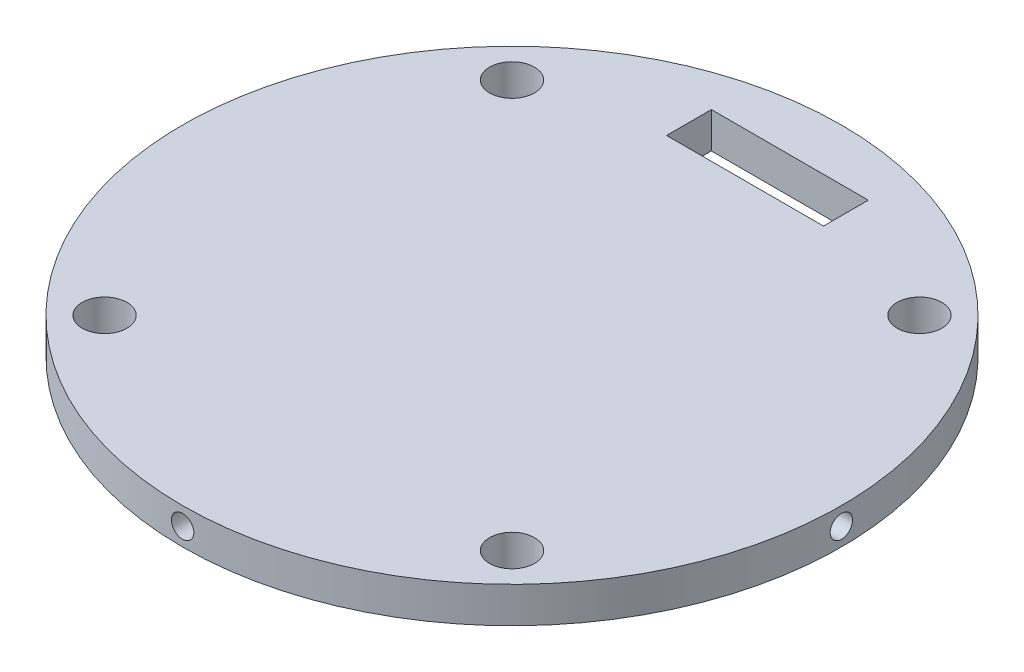
ISO-10303-21;
HEADER;
FILE_DESCRIPTION(('STEP AP214'),'2;1');
FILE_NAME('part.step','',(''),(''),'','','');
FILE_SCHEMA(('AUTOMOTIVE_DESIGN { 1 0 10303 214 1 1 1 1 }'));
ENDSEC;
DATA;
#1=APPLICATION_CONTEXT('core data for automotive mechanical design processes');
#2=APPLICATION_PROTOCOL_DEFINITION('international standard','automotive_design',2000,#1);
#3=PRODUCT_CONTEXT('',#1,'mechanical');
#4=PRODUCT('Part','Part','',(#3));
#5=PRODUCT_RELATED_PRODUCT_CATEGORY('part','',(#4));
#6=PRODUCT_DEFINITION_FORMATION('','',#4);
#7=PRODUCT_DEFINITION_CONTEXT('part definition',#1,'design');
#8=PRODUCT_DEFINITION('design','',#6,#7);
#9=PRODUCT_DEFINITION_SHAPE('','',#8);
#10=(LENGTH_UNIT() NAMED_UNIT(*) SI_UNIT(.MILLI.,.METRE.));
#11=(NAMED_UNIT(*) PLANE_ANGLE_UNIT() SI_UNIT($,.RADIAN.));
#12=(NAMED_UNIT(*) SI_UNIT($,.STERADIAN.) SOLID_ANGLE_UNIT());
#13=UNCERTAINTY_MEASURE_WITH_UNIT(LENGTH_MEASURE(1.E-05),#10,'distance_accuracy_value','');
#14=(GEOMETRIC_REPRESENTATION_CONTEXT(3) GLOBAL_UNCERTAINTY_ASSIGNED_CONTEXT((#13)) GLOBAL_UNIT_ASSIGNED_CONTEXT((#10,
#11,#12)) REPRESENTATION_CONTEXT('',''));
#15=CARTESIAN_POINT('',(0.,0.,0.));
#16=DIRECTION('',(0.,0.,1.));
#17=DIRECTION('',(1.,0.,0.));
#18=AXIS2_PLACEMENT_3D('',#15,#16,#17);
#19=CARTESIAN_POINT('',(0.,8.,0.));
#20=DIRECTION('',(0.,-1.,0.));
#21=DIRECTION('',(0.,0.,-1.));
#22=AXIS2_PLACEMENT_3D('',#19,#20,#21);
#23=CYLINDRICAL_SURFACE('',#22,73.5);
#24=CARTESIAN_POINT('',(73.4574706888278,4.,-2.5));
#25=CARTESIAN_POINT('',(73.4574712622716,3.85961748750618,-2.49999378797786));
#26=CARTESIAN_POINT('',(73.457877433653,3.71913421822508,-2.48813595638693));
#27=CARTESIAN_POINT('',(73.4594586071754,3.44203965206217,-2.44099893755281));
#28=CARTESIAN_POINT('',(73.4606345256605,3.30543317278096,-2.40569183443414));
#29=CARTESIAN_POINT('',(73.4636218332567,3.04014649894273,-2.312665230355));
#30=CARTESIAN_POINT('',(73.4654329093494,2.91146243671405,-2.25495676774213));
#31=CARTESIAN_POINT('',(73.4694860608808,2.66564409180731,-2.11878159039217));
#32=CARTESIAN_POINT('',(73.4717280316305,2.54850701414146,-2.04031991606191));
#33=CARTESIAN_POINT('',(73.4763917678385,2.32900797833675,-1.8648161098748));
#34=CARTESIAN_POINT('',(73.4788136166097,2.22665293213073,-1.767765334959));
#35=CARTESIAN_POINT('',(73.4835633926053,2.03968182025653,-1.55785397861684));
#36=CARTESIAN_POINT('',(73.4858913160716,1.95506646381763,-1.44499276539309));
#37=CARTESIAN_POINT('',(73.4901913220274,1.80596341937627,-1.20663547961479));
#38=CARTESIAN_POINT('',(73.4921633247484,1.74148024101822,-1.081136584511));
#39=CARTESIAN_POINT('',(73.495528498753,1.63450120402087,-0.821086431693563));
#40=CARTESIAN_POINT('',(73.4969216726875,1.59200524468784,-0.686535215439559));
#41=CARTESIAN_POINT('',(73.4989716685034,1.53022280831058,-0.412255408866176));
#42=CARTESIAN_POINT('',(73.49962877744,1.51092728320195,-0.272528858832926));
#43=CARTESIAN_POINT('',(73.5001335370028,1.49606555651991,0.00818155430278185));
#44=CARTESIAN_POINT('',(73.4999811913629,1.50049924548595,0.149165411602408));
#45=CARTESIAN_POINT('',(73.4988844585131,1.53296248777348,0.4283271409808));
#46=CARTESIAN_POINT('',(73.4979403988993,1.56098228163711,0.56650614943497));
#47=CARTESIAN_POINT('',(73.4953670036,1.63980724962831,0.836197980732511));
#48=CARTESIAN_POINT('',(73.4937376661873,1.69061248118368,0.967710786773639));
#49=CARTESIAN_POINT('',(73.4899767691777,1.81357733496299,1.22036846033966));
#50=CARTESIAN_POINT('',(73.4878451045113,1.885741425528,1.34151115156005));
#51=CARTESIAN_POINT('',(73.4833197582754,2.04937221514115,1.56996594533198));
#52=CARTESIAN_POINT('',(73.480926075906,2.14083897311817,1.67727800565857));
#53=CARTESIAN_POINT('',(73.4761449915797,2.34053392070794,1.87508223686694));
#54=CARTESIAN_POINT('',(73.4737575934187,2.44877057778614,1.96556585965951));
#55=CARTESIAN_POINT('',(73.4692594536802,2.67890303336849,2.12707889843305));
#56=CARTESIAN_POINT('',(73.4671487121518,2.80079883429518,2.19810831096368));
#57=CARTESIAN_POINT('',(73.4634419794378,3.05479425959919,2.31869576061696));
#58=CARTESIAN_POINT('',(73.4618459950669,3.1868940190337,2.36825351348837));
#59=CARTESIAN_POINT('',(73.4593490202683,3.4575453199057,2.44448534231775));
#60=CARTESIAN_POINT('',(73.4584480274123,3.59609683879799,2.47115949823439));
#61=CARTESIAN_POINT('',(73.4574430716175,3.8756442930076,2.50085644835012));
#62=CARTESIAN_POINT('',(73.4573387094769,4.01663896851986,2.5038910886235));
#63=CARTESIAN_POINT('',(73.4579377412626,4.29713573805479,2.48625374229215));
#64=CARTESIAN_POINT('',(73.4586411339745,4.43663783432062,2.46558179132065));
#65=CARTESIAN_POINT('',(73.46077602046,4.71015639074837,2.40112787809352));
#66=CARTESIAN_POINT('',(73.4622073444258,4.84417412239683,2.35735130546027));
#67=CARTESIAN_POINT('',(73.4656366007052,5.10295872858928,2.24793627086017));
#68=CARTESIAN_POINT('',(73.4676345345038,5.22772557888512,2.18229775159188));
#69=CARTESIAN_POINT('',(73.4719727646031,5.46452129599931,2.03099155343022));
#70=CARTESIAN_POINT('',(73.4743131970852,5.57654506437844,1.9453158993884));
#71=CARTESIAN_POINT('',(73.4790721118863,5.78462344538334,1.75637915139395));
#72=CARTESIAN_POINT('',(73.4814905944523,5.88067800742724,1.653118001742));
#73=CARTESIAN_POINT('',(73.4861341438352,6.0541309122446,1.43189071281271));
#74=CARTESIAN_POINT('',(73.4883591311991,6.13152161419251,1.31391858086674));
#75=CARTESIAN_POINT('',(73.4923637533814,6.26539772405102,1.06664864838359));
#76=CARTESIAN_POINT('',(73.494143389354,6.321883186151,0.937350877205171));
#77=CARTESIAN_POINT('',(73.4970563249387,6.41233200126797,0.671128703077347));
#78=CARTESIAN_POINT('',(73.4981897663099,6.4463002942651,0.534205980095394));
#79=CARTESIAN_POINT('',(73.4996831122391,6.49076673153445,0.256596892157334));
#80=CARTESIAN_POINT('',(73.500043018066,6.50126491430777,0.115910533375593));
#81=CARTESIAN_POINT('',(73.4999487332529,6.49849256865381,-0.165156005574351));
#82=CARTESIAN_POINT('',(73.4994949544985,6.48523406581328,-0.305536304657171));
#83=CARTESIAN_POINT('',(73.4978252330947,6.43534947000083,-0.582077162498));
#84=CARTESIAN_POINT('',(73.4966092889458,6.3987233310542,-0.718237712953299));
#85=CARTESIAN_POINT('',(73.4935521718467,6.30314504964116,-0.982477939537691));
#86=CARTESIAN_POINT('',(73.4917109890754,6.24419255647912,-1.11055748869598));
#87=CARTESIAN_POINT('',(73.487610787238,6.10563845355725,-1.35499928091319));
#88=CARTESIAN_POINT('',(73.4853517829152,6.02603757236324,-1.47136193719448));
#89=CARTESIAN_POINT('',(73.4806692227038,5.84840822124435,-1.68912375275256));
#90=CARTESIAN_POINT('',(73.4782456014582,5.75037240454409,-1.79051691746097));
#91=CARTESIAN_POINT('',(73.4735070684784,5.5386415436037,-1.97543412424416));
#92=CARTESIAN_POINT('',(73.4711921837825,5.42494263194273,-2.05895374006296));
#93=CARTESIAN_POINT('',(73.466931260077,5.18506142873199,-2.20577120126111));
#94=CARTESIAN_POINT('',(73.4649854795885,5.05887048119708,-2.26905489448613));
#95=CARTESIAN_POINT('',(73.4616867821721,4.79774522867527,-2.37346362297181));
#96=CARTESIAN_POINT('',(73.4603331597039,4.66282154984901,-2.4146150417272));
#97=CARTESIAN_POINT('',(73.4587327079301,4.43920649300823,-2.46270341977712));
#98=CARTESIAN_POINT('',(73.4582615118189,4.35196609015409,-2.47667199765444));
#99=CARTESIAN_POINT('',(73.4576303220448,4.17649706944645,-2.4953222389618));
#100=CARTESIAN_POINT('',(73.457470328263,4.08826845197044,-2.50000390593934));
#101=CARTESIAN_POINT('',(73.4574706888278,4.,-2.5));
#102=B_SPLINE_CURVE_WITH_KNOTS('',3,(#24,#25,#26,#27,#28,#29,#30,#31,#32,#33,#34,#35,#36,#37,
#38,#39,#40,#41,#42,#43,#44,#45,#46,#47,#48,#49,#50,#51,#52,#53,#54,#55,#56,#57,#58,#59,#60,#61,
#62,#63,#64,#65,#66,#67,#68,#69,#70,#71,#72,#73,#74,#75,#76,#77,#78,#79,#80,#81,#82,#83,#84,#85,
#86,#87,#88,#89,#90,#91,#92,#93,#94,#95,#96,#97,#98,#99,#100,#101),.UNSPECIFIED.,.T.,.F.,(4,2,2,
2,2,2,2,2,2,2,2,2,2,2,2,2,2,2,2,2,2,2,2,2,2,2,2,2,2,2,2,2,2,2,2,2,2,2,4),(0.,0.420825342517007,
0.842152569109672,1.26327244825028,1.68429014226457,2.10550406701698,2.52673482860853,
2.94805987906826,3.36938299999009,3.79054175344879,4.21169856414464,4.63268119420029,
5.05366488529501,5.47473670983931,5.895809819887,6.31709623543066,6.73838272569223,
7.15967479295841,7.58096538816182,8.00204485548073,8.42312368987853,8.844104342469,
9.26508609848301,9.68623569900684,10.1073866334811,10.528709691987,10.9500316583554,
11.3712611614319,11.7924899735099,12.2135056206399,12.6345220961009,13.055545185036,
13.4765534204478,13.8977297949575,14.3190103503826,14.7405848906068,15.1616557590356,
15.4262586291741,15.6908613982372),.UNSPECIFIED.);
#103=CARTESIAN_POINT('',(73.4574706888278,4.,-2.5));
#104=VERTEX_POINT('',#103);
#105=EDGE_CURVE('E76',#104,#104,#102,.T.);
#106=ORIENTED_EDGE('',*,*,#105,.T.);
#107=EDGE_LOOP('',(#106));
#108=FACE_BOUND('',#107,.T.);
#109=CARTESIAN_POINT('',(2.5,4.,73.4574706888278));
#110=CARTESIAN_POINT('',(2.49999378797786,3.85961748750618,73.4574712622716));
#111=CARTESIAN_POINT('',(2.48813595638693,3.71913421822508,73.457877433653));
#112=CARTESIAN_POINT('',(2.44099893755281,3.44203965206217,73.4594586071754));
#113=CARTESIAN_POINT('',(2.40569183443414,3.30543317278096,73.4606345256605));
#114=CARTESIAN_POINT('',(2.312665230355,3.04014649894273,73.4636218332567));
#115=CARTESIAN_POINT('',(2.25495676774213,2.91146243671405,73.4654329093494));
#116=CARTESIAN_POINT('',(2.11878159039218,2.66564409180731,73.4694860608808));
#117=CARTESIAN_POINT('',(2.04031991606191,2.54850701414146,73.4717280316305));
#118=CARTESIAN_POINT('',(1.8648161098748,2.32900797833675,73.4763917678385));
#119=CARTESIAN_POINT('',(1.767765334959,2.22665293213073,73.4788136166097));
#120=CARTESIAN_POINT('',(1.55785397861684,2.03968182025654,73.4835633926053));
#121=CARTESIAN_POINT('',(1.44499276539309,1.95506646381763,73.4858913160716));
#122=CARTESIAN_POINT('',(1.20663547961479,1.80596341937627,73.4901913220274));
#123=CARTESIAN_POINT('',(1.081136584511,1.74148024101822,73.4921633247484));
#124=CARTESIAN_POINT('',(0.821086431693563,1.63450120402087,73.495528498753));
#125=CARTESIAN_POINT('',(0.686535215439558,1.59200524468784,73.4969216726875));
#126=CARTESIAN_POINT('',(0.412255408866175,1.53022280831058,73.4989716685034));
#127=CARTESIAN_POINT('',(0.272528858832926,1.51092728320195,73.49962877744));
#128=CARTESIAN_POINT('',(-0.00818155430278177,1.49606555651991,73.5001335370028));
#129=CARTESIAN_POINT('',(-0.149165411602408,1.50049924548595,73.4999811913629));
#130=CARTESIAN_POINT('',(-0.428327140980801,1.53296248777348,73.4988844585131));
#131=CARTESIAN_POINT('',(-0.566506149434971,1.56098228163711,73.4979403988993));
#132=CARTESIAN_POINT('',(-0.836197980732512,1.63980724962831,73.4953670036));
#133=CARTESIAN_POINT('',(-0.967710786773639,1.69061248118368,73.4937376661873));
#134=CARTESIAN_POINT('',(-1.22036846033966,1.81357733496299,73.4899767691777));
#135=CARTESIAN_POINT('',(-1.34151115156005,1.88574142552799,73.4878451045113));
#136=CARTESIAN_POINT('',(-1.56996594533198,2.04937221514115,73.4833197582754));
#137=CARTESIAN_POINT('',(-1.67727800565857,2.14083897311817,73.480926075906));
#138=CARTESIAN_POINT('',(-1.87508223686694,2.34053392070794,73.4761449915797));
#139=CARTESIAN_POINT('',(-1.96556585965951,2.44877057778614,73.4737575934187));
#140=CARTESIAN_POINT('',(-2.12707889843305,2.67890303336849,73.4692594536802));
#141=CARTESIAN_POINT('',(-2.19810831096368,2.80079883429518,73.4671487121518));
#142=CARTESIAN_POINT('',(-2.31869576061696,3.05479425959919,73.4634419794378));
#143=CARTESIAN_POINT('',(-2.36825351348837,3.1868940190337,73.4618459950669));
#144=CARTESIAN_POINT('',(-2.44448534231775,3.4575453199057,73.4593490202683));
#145=CARTESIAN_POINT('',(-2.47115949823439,3.59609683879799,73.4584480274123));
#146=CARTESIAN_POINT('',(-2.50085644835012,3.8756442930076,73.4574430716175));
#147=CARTESIAN_POINT('',(-2.5038910886235,4.01663896851986,73.4573387094769));
#148=CARTESIAN_POINT('',(-2.48625374229215,4.29713573805479,73.4579377412626));
#149=CARTESIAN_POINT('',(-2.46558179132065,4.43663783432062,73.4586411339745));
#150=CARTESIAN_POINT('',(-2.40112787809352,4.71015639074837,73.46077602046));
#151=CARTESIAN_POINT('',(-2.35735130546027,4.84417412239683,73.4622073444258));
#152=CARTESIAN_POINT('',(-2.24793627086017,5.10295872858928,73.4656366007052));
#153=CARTESIAN_POINT('',(-2.18229775159188,5.22772557888512,73.4676345345038));
#154=CARTESIAN_POINT('',(-2.03099155343022,5.46452129599931,73.4719727646031));
#155=CARTESIAN_POINT('',(-1.9453158993884,5.57654506437844,73.4743131970852));
#156=CARTESIAN_POINT('',(-1.75637915139395,5.78462344538334,73.4790721118863));
#157=CARTESIAN_POINT('',(-1.653118001742,5.88067800742724,73.4814905944523));
#158=CARTESIAN_POINT('',(-1.43189071281271,6.0541309122446,73.4861341438352));
#159=CARTESIAN_POINT('',(-1.31391858086674,6.13152161419251,73.4883591311991));
#160=CARTESIAN_POINT('',(-1.06664864838359,6.26539772405102,73.4923637533814));
#161=CARTESIAN_POINT('',(-0.937350877205169,6.321883186151,73.494143389354));
#162=CARTESIAN_POINT('',(-0.671128703077346,6.41233200126797,73.4970563249387));
#163=CARTESIAN_POINT('',(-0.534205980095393,6.4463002942651,73.4981897663099));
#164=CARTESIAN_POINT('',(-0.256596892157332,6.49076673153445,73.4996831122391));
#165=CARTESIAN_POINT('',(-0.115910533375592,6.50126491430777,73.500043018066));
#166=CARTESIAN_POINT('',(0.165156005574352,6.49849256865381,73.4999487332529));
#167=CARTESIAN_POINT('',(0.305536304657172,6.48523406581328,73.4994949544985));
#168=CARTESIAN_POINT('',(0.582077162498,6.43534947000083,73.4978252330947));
#169=CARTESIAN_POINT('',(0.718237712953299,6.3987233310542,73.4966092889458));
#170=CARTESIAN_POINT('',(0.982477939537691,6.30314504964116,73.4935521718467));
#171=CARTESIAN_POINT('',(1.11055748869598,6.24419255647912,73.4917109890754));
#172=CARTESIAN_POINT('',(1.35499928091319,6.10563845355725,73.487610787238));
#173=CARTESIAN_POINT('',(1.47136193719448,6.02603757236324,73.4853517829152));
#174=CARTESIAN_POINT('',(1.68912375275256,5.84840822124435,73.4806692227038));
#175=CARTESIAN_POINT('',(1.79051691746097,5.75037240454409,73.4782456014582));
#176=CARTESIAN_POINT('',(1.97543412424416,5.5386415436037,73.4735070684784));
#177=CARTESIAN_POINT('',(2.05895374006296,5.42494263194272,73.4711921837825));
#178=CARTESIAN_POINT('',(2.20577120126111,5.18506142873199,73.466931260077));
#179=CARTESIAN_POINT('',(2.26905489448613,5.05887048119708,73.4649854795885));
#180=CARTESIAN_POINT('',(2.37346362297181,4.79774522867527,73.4616867821721));
#181=CARTESIAN_POINT('',(2.4146150417272,4.66282154984901,73.4603331597039));
#182=CARTESIAN_POINT('',(2.46270341977712,4.43920649300823,73.4587327079301));
#183=CARTESIAN_POINT('',(2.47667199765444,4.35196609015409,73.4582615118189));
#184=CARTESIAN_POINT('',(2.4953222389618,4.17649706944645,73.4576303220448));
#185=CARTESIAN_POINT('',(2.50000390593934,4.08826845197044,73.457470328263));
#186=CARTESIAN_POINT('',(2.5,4.,73.4574706888278));
#187=B_SPLINE_CURVE_WITH_KNOTS('',3,(#109,#110,#111,#112,#113,#114,#115,#116,#117,#118,#119,
#120,#121,#122,#123,#124,#125,#126,#127,#128,#129,#130,#131,#132,#133,#134,#135,#136,#137,#138,
#139,#140,#141,#142,#143,#144,#145,#146,#147,#148,#149,#150,#151,#152,#153,#154,#155,#156,#157,
#158,#159,#160,#161,#162,#163,#164,#165,#166,#167,#168,#169,#170,#171,#172,#173,#174,#175,#176,
#177,#178,#179,#180,#181,#182,#183,#184,#185,#186),.UNSPECIFIED.,.T.,.F.,(4,2,2,2,2,2,2,2,2,2,2,
2,2,2,2,2,2,2,2,2,2,2,2,2,2,2,2,2,2,2,2,2,2,2,2,2,2,2,4),(0.,0.420825342517007,
0.842152569109672,1.26327244825028,1.68429014226457,2.10550406701698,2.52673482860853,
2.94805987906826,3.36938299999009,3.79054175344879,4.21169856414464,4.63268119420029,
5.05366488529501,5.47473670983931,5.895809819887,6.31709623543066,6.73838272569223,
7.15967479295841,7.58096538816182,8.00204485548073,8.42312368987853,8.844104342469,
9.26508609848301,9.68623569900685,10.1073866334811,10.528709691987,10.9500316583554,
11.3712611614319,11.7924899735099,12.2135056206399,12.6345220961009,13.055545185036,
13.4765534204478,13.8977297949575,14.3190103503826,14.7405848906068,15.1616557590356,
15.4262586291741,15.6908613982372),.UNSPECIFIED.);
#188=CARTESIAN_POINT('',(2.5,4.,73.4574706888278));
#189=VERTEX_POINT('',#188);
#190=EDGE_CURVE('E165',#189,#189,#187,.T.);
#191=ORIENTED_EDGE('',*,*,#190,.T.);
#192=EDGE_LOOP('',(#191));
#193=FACE_BOUND('',#192,.T.);
#194=CARTESIAN_POINT('',(0.,8.,0.));
#195=DIRECTION('',(0.,1.,0.));
#196=DIRECTION('',(0.,0.,1.));
#197=AXIS2_PLACEMENT_3D('',#194,#195,#196);
#198=CIRCLE('',#197,73.5);
#199=CARTESIAN_POINT('',(0.,8.,73.5));
#200=VERTEX_POINT('',#199);
#201=EDGE_CURVE('E161',#200,#200,#198,.T.);
#202=ORIENTED_EDGE('',*,*,#201,.F.);
#203=EDGE_LOOP('',(#202));
#204=FACE_BOUND('',#203,.T.);
#205=CARTESIAN_POINT('',(0.,0.,0.));
#206=DIRECTION('',(0.,1.,0.));
#207=DIRECTION('',(0.,0.,1.));
#208=AXIS2_PLACEMENT_3D('',#205,#206,#207);
#209=CIRCLE('',#208,73.5);
#210=CARTESIAN_POINT('',(0.,0.,73.5));
#211=VERTEX_POINT('',#210);
#212=EDGE_CURVE('E127',#211,#211,#209,.T.);
#213=ORIENTED_EDGE('',*,*,#212,.T.);
#214=EDGE_LOOP('',(#213));
#215=FACE_BOUND('',#214,.T.);
#216=CARTESIAN_POINT('',(0.,6.5,-73.5));
#217=CARTESIAN_POINT('',(0.140382538984424,6.49999378800196,-73.4999994278152));
#218=CARTESIAN_POINT('',(0.280865834664872,6.48813595208722,-73.4995934976701));
#219=CARTESIAN_POINT('',(0.557960455680913,6.44099891451636,-73.4980131855351));
#220=CARTESIAN_POINT('',(0.694566963436558,6.40569179707416,-73.4968378876561));
#221=CARTESIAN_POINT('',(0.959853697461806,6.31266515108598,-73.493851927307));
#222=CARTESIAN_POINT('',(1.08853779116185,6.2549566602038,-73.4920415777834));
#223=CARTESIAN_POINT('',(1.33435618870694,6.11878141630065,-73.4879896671177));
#224=CARTESIAN_POINT('',(1.45149328757978,6.0403197037568,-73.4857482107175));
#225=CARTESIAN_POINT('',(1.67099229905839,5.86481585912662,-73.4810850673533));
#226=CARTESIAN_POINT('',(1.77334730653927,5.76776509250281,-73.4786632969551));
#227=CARTESIAN_POINT('',(1.96031834378135,5.55785376895374,-73.4739132059357));
#228=CARTESIAN_POINT('',(2.0449336641947,5.44499258012605,-73.4715848890544));
#229=CARTESIAN_POINT('',(2.19403667125942,5.20663531534524,-73.4672837962089));
#230=CARTESIAN_POINT('',(2.25851984156745,5.08113641265133,-73.4653111000646));
#231=CARTESIAN_POINT('',(2.36549886158231,4.82108624332836,-73.4619445438615));
#232=CARTESIAN_POINT('',(2.40799481208088,4.68653501819929,-73.4605506811492));
#233=CARTESIAN_POINT('',(2.46977722955959,4.41225518598351,-73.4584996149302));
#234=CARTESIAN_POINT('',(2.48907274398144,4.27252861904397,-73.4578421242683));
#235=CARTESIAN_POINT('',(2.50393444343375,3.99181817291948,-73.4573370753577));
#236=CARTESIAN_POINT('',(2.49950073803711,3.85083429954331,-73.4574895133689));
#237=CARTESIAN_POINT('',(2.46703747005589,3.57167264348462,-73.4585868643791));
#238=CARTESIAN_POINT('',(2.43901768346014,3.43349372249889,-73.4595314490475));
#239=CARTESIAN_POINT('',(2.36019276044906,3.16380206239607,-73.4621060967638));
#240=CARTESIAN_POINT('',(2.30938756644436,3.03228934012853,-73.4637361615444));
#241=CARTESIAN_POINT('',(2.18642278975219,2.77963176686817,-73.4674983981412));
#242=CARTESIAN_POINT('',(2.11425872985278,2.65848909650015,-73.4696306752114));
#243=CARTESIAN_POINT('',(1.95062800533507,2.4300343313642,-73.4741568622327));
#244=CARTESIAN_POINT('',(1.85916128180767,2.32272227880703,-73.4765507729824));
#245=CARTESIAN_POINT('',(1.65946635826392,2.12491800749424,-73.4813318312139));
#246=CARTESIAN_POINT('',(1.55122968384991,2.03443434381682,-73.4837189746514));
#247=CARTESIAN_POINT('',(1.32109717915791,1.87292123087041,-73.4882162320466));
#248=CARTESIAN_POINT('',(1.19920134651465,1.80189178497017,-73.4903263459563));
#249=CARTESIAN_POINT('',(0.945205913456655,1.68130431145119,-73.4940317249041));
#250=CARTESIAN_POINT('',(0.813106182949321,1.63174655763485,-73.4956269833769));
#251=CARTESIAN_POINT('',(0.542454944826804,1.55551471801459,-73.4981227273887));
#252=CARTESIAN_POINT('',(0.403903459708727,1.52884055242248,-73.4990232153503));
#253=CARTESIAN_POINT('',(0.124356019868988,1.49914356595111,-73.5000276044833));
#254=CARTESIAN_POINT('',(-0.0166386760283466,1.49610890821867,-73.5001319043241));
#255=CARTESIAN_POINT('',(-0.297135490556803,1.51374622691178,-73.4995332169696));
#256=CARTESIAN_POINT('',(-0.43663761143122,1.53441816770197,-73.4988302309878));
#257=CARTESIAN_POINT('',(-0.710156283495734,1.59887208508942,-73.4966964484268));
#258=CARTESIAN_POINT('',(-0.844174103749516,1.64264868232644,-73.4952658212642));
#259=CARTESIAN_POINT('',(-1.10295887622977,1.75206379589191,-73.4918379435318));
#260=CARTESIAN_POINT('',(-1.22772580426884,1.81770236937827,-73.4898406914806));
#261=CARTESIAN_POINT('',(-1.4645215722817,1.96900864616024,-73.4855035131953));
#262=CARTESIAN_POINT('',(-1.57654532263404,2.05468431080589,-73.4831634508906));
#263=CARTESIAN_POINT('',(-1.78462366231034,2.2436210698814,-73.4784048010443));
#264=CARTESIAN_POINT('',(-1.88067820097591,2.34688222009477,-73.4759862132537));
#265=CARTESIAN_POINT('',(-2.05413105822083,2.5681094984014,-73.4713420241594));
#266=CARTESIAN_POINT('',(-2.13152173599086,2.68608161914558,-73.4691165021331));
#267=CARTESIAN_POINT('',(-2.26539780336311,2.93335152305609,-73.465110615266));
#268=CARTESIAN_POINT('',(-2.32188324715466,3.06264927686371,-73.4633302492713));
#269=CARTESIAN_POINT('',(-2.41233204949503,3.32887146435197,-73.4604159782144));
#270=CARTESIAN_POINT('',(-2.4463003401112,3.46579422075523,-73.4592819315927));
#271=CARTESIAN_POINT('',(-2.4907667612835,3.74340337894073,-73.457787765796));
#272=CARTESIAN_POINT('',(-2.50126493051736,3.88408977452029,-73.4574276453457));
#273=CARTESIAN_POINT('',(-2.4984925466326,4.16515628784824,-73.4575219859641));
#274=CARTESIAN_POINT('',(-2.48523403517698,4.30553652467224,-73.4579760343512));
#275=CARTESIAN_POINT('',(-2.43534944409671,4.58207725592089,-73.4596466603056));
#276=CARTESIAN_POINT('',(-2.39872331838532,4.71823774202257,-73.4608632393767));
#277=CARTESIAN_POINT('',(-2.30314508631466,4.98247784410426,-73.4639217136883));
#278=CARTESIAN_POINT('',(-2.24419262919472,5.11055733308986,-73.4657636187531));
#279=CARTESIAN_POINT('',(-2.10563861687906,5.35499902009289,-73.4698650359931));
#280=CARTESIAN_POINT('',(-2.02603779018446,5.47136163129586,-73.4721245334344));
#281=CARTESIAN_POINT('',(-1.84840849760427,5.68912345283528,-73.4768076367129));
#282=CARTESIAN_POINT('',(-1.75037267258214,5.79051665852353,-73.4792313078392));
#283=CARTESIAN_POINT('',(-1.53864177833553,5.97543394408469,-73.4839694736155));
#284=CARTESIAN_POINT('',(-1.42494284177839,6.0589535978068,-73.4862839411123));
#285=CARTESIAN_POINT('',(-1.18506161972667,6.2057710982079,-73.4905437451081));
#286=CARTESIAN_POINT('',(-1.05887068266936,6.26905479996925,-73.4924888230202));
#287=CARTESIAN_POINT('',(-0.797745452640491,6.37346354734945,-73.4957861403198));
#288=CARTESIAN_POINT('',(-0.662821785772331,6.41461497632609,-73.4971390852151));
#289=CARTESIAN_POINT('',(-0.439206701433079,6.46270338419028,-73.4987386933374));
#290=CARTESIAN_POINT('',(-0.351966257017748,6.47667197545255,-73.4992096268259));
#291=CARTESIAN_POINT('',(-0.176497152977433,6.49532223454973,-73.4998404599846));
#292=CARTESIAN_POINT('',(-0.0882684937292193,6.5000039059253,-73.5000003597733));
#293=CARTESIAN_POINT('',(0.,6.5,-73.5));
#294=B_SPLINE_CURVE_WITH_KNOTS('',3,(#216,#217,#218,#219,#220,#221,#222,#223,#224,#225,#226,
#227,#228,#229,#230,#231,#232,#233,#234,#235,#236,#237,#238,#239,#240,#241,#242,#243,#244,#245,
#246,#247,#248,#249,#250,#251,#252,#253,#254,#255,#256,#257,#258,#259,#260,#261,#262,#263,#264,
#265,#266,#267,#268,#269,#270,#271,#272,#273,#274,#275,#276,#277,#278,#279,#280,#281,#282,#283,
#284,#285,#286,#287,#288,#289,#290,#291,#292,#293),.UNSPECIFIED.,.T.,.F.,(4,2,2,2,2,2,2,2,2,2,2,
2,2,2,2,2,2,2,2,2,2,2,2,2,2,2,2,2,2,2,2,2,2,2,2,2,2,2,4),(0.,0.420825422071724,
0.842152726489436,1.26327269637426,1.68429047973583,2.10550430042737,2.52673496077095,
2.94806005005381,3.36938320792081,3.79054200963936,4.21169886660157,4.63268124784051,
5.05366469310461,5.47473644683094,5.89580948562934,6.31709600442943,6.73838259618098,
7.15967455993046,7.5809650547555,8.00204458603132,8.42312348434848,8.84410438785236,
9.26508639201494,9.68623595025574,10.1073868444642,10.5287098623156,10.9500317880304,
11.3712613985522,11.7924903149057,12.2135057813275,12.634522078099,13.0555449895751,
13.4765530488395,13.8977295300577,14.3190101897277,14.7405846838421,15.1616555087977,
15.4262585040121,15.6908613983461),.UNSPECIFIED.);
#295=CARTESIAN_POINT('',(0.,6.5,-73.5));
#296=VERTEX_POINT('',#295);
#297=EDGE_CURVE('E176',#296,#296,#294,.T.);
#298=ORIENTED_EDGE('',*,*,#297,.F.);
#299=EDGE_LOOP('',(#298));
#300=FACE_BOUND('',#299,.T.);
#301=CARTESIAN_POINT('',(-73.4574706888278,4.,2.5));
#302=CARTESIAN_POINT('',(-73.4574712622716,4.14038251249382,2.49999378797786));
#303=CARTESIAN_POINT('',(-73.457877433653,4.28086578177492,2.48813595638693));
#304=CARTESIAN_POINT('',(-73.4594586071754,4.55796034793783,2.44099893755281));
#305=CARTESIAN_POINT('',(-73.4606345256605,4.69456682721904,2.40569183443414));
#306=CARTESIAN_POINT('',(-73.4636218332567,4.95985350105727,2.312665230355));
#307=CARTESIAN_POINT('',(-73.4654329093494,5.08853756328595,2.25495676774213));
#308=CARTESIAN_POINT('',(-73.4694860608808,5.33435590819269,2.11878159039218));
#309=CARTESIAN_POINT('',(-73.4717280316305,5.45149298585854,2.04031991606191));
#310=CARTESIAN_POINT('',(-73.4763917678385,5.67099202166325,1.8648161098748));
#311=CARTESIAN_POINT('',(-73.4788136166097,5.77334706786927,1.767765334959));
#312=CARTESIAN_POINT('',(-73.4835633926053,5.96031817974347,1.55785397861684));
#313=CARTESIAN_POINT('',(-73.4858913160716,6.04493353618237,1.44499276539309));
#314=CARTESIAN_POINT('',(-73.4901913220274,6.19403658062373,1.20663547961479));
#315=CARTESIAN_POINT('',(-73.4921633247484,6.25851975898178,1.081136584511));
#316=CARTESIAN_POINT('',(-73.495528498753,6.36549879597913,0.821086431693562));
#317=CARTESIAN_POINT('',(-73.4969216726875,6.40799475531217,0.686535215439559));
#318=CARTESIAN_POINT('',(-73.4989716685034,6.46977719168942,0.412255408866175));
#319=CARTESIAN_POINT('',(-73.49962877744,6.48907271679805,0.272528858832926));
#320=CARTESIAN_POINT('',(-73.5001335370028,6.50393444348009,-0.00818155430278185));
#321=CARTESIAN_POINT('',(-73.4999811913629,6.49950075451405,-0.149165411602408));
#322=CARTESIAN_POINT('',(-73.4988844585131,6.46703751222652,-0.428327140980801));
#323=CARTESIAN_POINT('',(-73.4979403988993,6.43901771836289,-0.56650614943497));
#324=CARTESIAN_POINT('',(-73.4953670036,6.36019275037169,-0.836197980732511));
#325=CARTESIAN_POINT('',(-73.4937376661873,6.30938751881632,-0.967710786773638));
#326=CARTESIAN_POINT('',(-73.4899767691777,6.18642266503701,-1.22036846033966));
#327=CARTESIAN_POINT('',(-73.4878451045113,6.11425857447201,-1.34151115156005));
#328=CARTESIAN_POINT('',(-73.4833197582754,5.95062778485885,-1.56996594533198));
#329=CARTESIAN_POINT('',(-73.480926075906,5.85916102688183,-1.67727800565857));
#330=CARTESIAN_POINT('',(-73.4761449915797,5.65946607929206,-1.87508223686694));
#331=CARTESIAN_POINT('',(-73.4737575934187,5.55122942221386,-1.96556585965951));
#332=CARTESIAN_POINT('',(-73.4692594536802,5.32109696663151,-2.12707889843305));
#333=CARTESIAN_POINT('',(-73.4671487121518,5.19920116570482,-2.19810831096368));
#334=CARTESIAN_POINT('',(-73.4634419794378,4.94520574040081,-2.31869576061696));
#335=CARTESIAN_POINT('',(-73.4618459950669,4.8131059809663,-2.36825351348837));
#336=CARTESIAN_POINT('',(-73.4593490202683,4.5424546800943,-2.44448534231775));
#337=CARTESIAN_POINT('',(-73.4584480274123,4.40390316120201,-2.47115949823439));
#338=CARTESIAN_POINT('',(-73.4574430716175,4.1243557069924,-2.50085644835012));
#339=CARTESIAN_POINT('',(-73.4573387094769,3.98336103148014,-2.5038910886235));
#340=CARTESIAN_POINT('',(-73.4579377412626,3.70286426194521,-2.48625374229215));
#341=CARTESIAN_POINT('',(-73.4586411339745,3.56336216567938,-2.46558179132065));
#342=CARTESIAN_POINT('',(-73.46077602046,3.28984360925163,-2.40112787809352));
#343=CARTESIAN_POINT('',(-73.4622073444258,3.15582587760317,-2.35735130546027));
#344=CARTESIAN_POINT('',(-73.4656366007052,2.89704127141072,-2.24793627086017));
#345=CARTESIAN_POINT('',(-73.4676345345038,2.77227442111488,-2.18229775159188));
#346=CARTESIAN_POINT('',(-73.471972764603,2.53547870400069,-2.03099155343022));
#347=CARTESIAN_POINT('',(-73.4743131970852,2.42345493562157,-1.9453158993884));
#348=CARTESIAN_POINT('',(-73.4790721118862,2.21537655461666,-1.75637915139395));
#349=CARTESIAN_POINT('',(-73.4814905944523,2.11932199257276,-1.65311800174201));
#350=CARTESIAN_POINT('',(-73.4861341438352,1.9458690877554,-1.43189071281271));
#351=CARTESIAN_POINT('',(-73.4883591311991,1.86847838580749,-1.31391858086674));
#352=CARTESIAN_POINT('',(-73.4923637533814,1.73460227594898,-1.06664864838359));
#353=CARTESIAN_POINT('',(-73.494143389354,1.678116813849,-0.937350877205171));
#354=CARTESIAN_POINT('',(-73.4970563249387,1.58766799873203,-0.671128703077347));
#355=CARTESIAN_POINT('',(-73.4981897663099,1.5536997057349,-0.534205980095394));
#356=CARTESIAN_POINT('',(-73.4996831122391,1.50923326846555,-0.256596892157333));
#357=CARTESIAN_POINT('',(-73.500043018066,1.49873508569223,-0.115910533375593));
#358=CARTESIAN_POINT('',(-73.4999487332529,1.50150743134619,0.165156005574351));
#359=CARTESIAN_POINT('',(-73.4994949544985,1.51476593418672,0.30553630465717));
#360=CARTESIAN_POINT('',(-73.4978252330947,1.56465052999917,0.582077162497999));
#361=CARTESIAN_POINT('',(-73.4966092889458,1.6012766689458,0.718237712953298));
#362=CARTESIAN_POINT('',(-73.4935521718467,1.69685495035884,0.98247793953769));
#363=CARTESIAN_POINT('',(-73.4917109890754,1.75580744352088,1.11055748869598));
#364=CARTESIAN_POINT('',(-73.487610787238,1.89436154644275,1.35499928091319));
#365=CARTESIAN_POINT('',(-73.4853517829152,1.97396242763676,1.47136193719448));
#366=CARTESIAN_POINT('',(-73.4806692227038,2.15159177875565,1.68912375275256));
#367=CARTESIAN_POINT('',(-73.4782456014582,2.24962759545591,1.79051691746097));
#368=CARTESIAN_POINT('',(-73.4735070684784,2.4613584563963,1.97543412424415));
#369=CARTESIAN_POINT('',(-73.4711921837825,2.57505736805727,2.05895374006296));
#370=CARTESIAN_POINT('',(-73.466931260077,2.81493857126801,2.20577120126111));
#371=CARTESIAN_POINT('',(-73.4649854795885,2.94112951880292,2.26905489448613));
#372=CARTESIAN_POINT('',(-73.4616867821721,3.20225477132473,2.37346362297181));
#373=CARTESIAN_POINT('',(-73.4603331597039,3.33717845015099,2.4146150417272));
#374=CARTESIAN_POINT('',(-73.4587327079301,3.56079350699177,2.46270341977712));
#375=CARTESIAN_POINT('',(-73.4582615118189,3.64803390984591,2.47667199765444));
#376=CARTESIAN_POINT('',(-73.4576303220448,3.82350293055355,2.4953222389618));
#377=CARTESIAN_POINT('',(-73.457470328263,3.91173154802956,2.50000390593934));
#378=CARTESIAN_POINT('',(-73.4574706888278,4.,2.5));
#379=B_SPLINE_CURVE_WITH_KNOTS('',3,(#301,#302,#303,#304,#305,#306,#307,#308,#309,#310,#311,
#312,#313,#314,#315,#316,#317,#318,#319,#320,#321,#322,#323,#324,#325,#326,#327,#328,#329,#330,
#331,#332,#333,#334,#335,#336,#337,#338,#339,#340,#341,#342,#343,#344,#345,#346,#347,#348,#349,
#350,#351,#352,#353,#354,#355,#356,#357,#358,#359,#360,#361,#362,#363,#364,#365,#366,#367,#368,
#369,#370,#371,#372,#373,#374,#375,#376,#377,#378),.UNSPECIFIED.,.T.,.F.,(4,2,2,2,2,2,2,2,2,2,2,
2,2,2,2,2,2,2,2,2,2,2,2,2,2,2,2,2,2,2,2,2,2,2,2,2,2,2,4),(0.,0.420825342517009,
0.842152569109672,1.26327244825028,1.68429014226457,2.10550406701698,2.52673482860853,
2.94805987906826,3.36938299999009,3.79054175344879,4.21169856414464,4.63268119420029,
5.05366488529501,5.47473670983931,5.895809819887,6.31709623543066,6.73838272569223,
7.15967479295842,7.58096538816182,8.00204485548073,8.42312368987853,8.84410434246901,
9.26508609848301,9.68623569900684,10.1073866334811,10.528709691987,10.9500316583554,
11.3712611614319,11.7924899735099,12.2135056206399,12.6345220961009,13.055545185036,
13.4765534204478,13.8977297949575,14.3190103503826,14.7405848906068,15.1616557590356,
15.4262586291741,15.6908613982372),.UNSPECIFIED.);
#380=CARTESIAN_POINT('',(-73.4574706888278,4.,2.5));
#381=VERTEX_POINT('',#380);
#382=EDGE_CURVE('E12',#381,#381,#379,.T.);
#383=ORIENTED_EDGE('',*,*,#382,.F.);
#384=EDGE_LOOP('',(#383));
#385=FACE_BOUND('',#384,.T.);
#386=ADVANCED_FACE('F63',(#108,#193,#204,#215,#300,#385),#23,.T.);
#387=CARTESIAN_POINT('',(0.,8.,0.));
#388=DIRECTION('',(0.,1.,0.));
#389=DIRECTION('',(0.,0.,1.));
#390=AXIS2_PLACEMENT_3D('',#387,#388,#389);
#391=PLANE('',#390);
#392=CARTESIAN_POINT('',(45.4373213844974,8.,-45.4373213845258));
#393=DIRECTION('',(0.,1.,0.));
#394=DIRECTION('',(0.,0.,-1.));
#395=AXIS2_PLACEMENT_3D('',#392,#393,#394);
#396=CIRCLE('',#395,5.);
#397=CARTESIAN_POINT('',(45.4373213844974,8.,-50.4373213845258));
#398=VERTEX_POINT('',#397);
#399=EDGE_CURVE('E304',#398,#398,#396,.T.);
#400=ORIENTED_EDGE('',*,*,#399,.F.);
#401=EDGE_LOOP('',(#400));
#402=FACE_BOUND('',#401,.T.);
#403=CARTESIAN_POINT('',(-45.4373213844974,8.,-45.4373213845258));
#404=DIRECTION('',(0.,1.,0.));
#405=DIRECTION('',(0.,0.,1.));
#406=AXIS2_PLACEMENT_3D('',#403,#404,#405);
#407=CIRCLE('',#406,5.);
#408=CARTESIAN_POINT('',(-45.4373213844974,8.,-40.4373213845258));
#409=VERTEX_POINT('',#408);
#410=EDGE_CURVE('E145',#409,#409,#407,.T.);
#411=ORIENTED_EDGE('',*,*,#410,.F.);
#412=EDGE_LOOP('',(#411));
#413=FACE_BOUND('',#412,.T.);
#414=ORIENTED_EDGE('',*,*,#201,.T.);
#415=EDGE_LOOP('',(#414));
#416=FACE_BOUND('',#415,.T.);
#417=DIRECTION('',(1.,0.,0.));
#418=VECTOR('',#417,1.);
#419=CARTESIAN_POINT('',(-17.5,8.,-51.9671790390726));
#420=LINE('',#419,#418);
#421=CARTESIAN_POINT('',(-17.5,8.,-51.9671790390726));
#422=VERTEX_POINT('',#421);
#423=CARTESIAN_POINT('',(17.5,8.,-51.9671790390726));
#424=VERTEX_POINT('',#423);
#425=EDGE_CURVE('E118',#422,#424,#420,.T.);
#426=ORIENTED_EDGE('',*,*,#425,.F.);
#427=DIRECTION('',(0.,0.,1.));
#428=VECTOR('',#427,1.);
#429=CARTESIAN_POINT('',(-17.5,8.,-61.9671790390726));
#430=LINE('',#429,#428);
#431=CARTESIAN_POINT('',(-17.5,8.,-61.9671790390726));
#432=VERTEX_POINT('',#431);
#433=EDGE_CURVE('E109',#432,#422,#430,.T.);
#434=ORIENTED_EDGE('',*,*,#433,.F.);
#435=DIRECTION('',(-1.,0.,0.));
#436=VECTOR('',#435,1.);
#437=CARTESIAN_POINT('',(-17.5,8.,-61.9671790390726));
#438=LINE('',#437,#436);
#439=CARTESIAN_POINT('',(17.5,8.,-61.9671790390726));
#440=VERTEX_POINT('',#439);
#441=EDGE_CURVE('E137',#440,#432,#438,.T.);
#442=ORIENTED_EDGE('',*,*,#441,.F.);
#443=DIRECTION('',(0.,0.,-1.));
#444=VECTOR('',#443,1.);
#445=CARTESIAN_POINT('',(17.5,8.,-51.9671790390726));
#446=LINE('',#445,#444);
#447=EDGE_CURVE('E133',#424,#440,#446,.T.);
#448=ORIENTED_EDGE('',*,*,#447,.F.);
#449=EDGE_LOOP('',(#426,#434,#442,#448));
#450=FACE_BOUND('',#449,.T.);
#451=CARTESIAN_POINT('',(-45.4373213844974,8.,45.4373213845258));
#452=DIRECTION('',(0.,1.,0.));
#453=DIRECTION('',(0.,0.,-1.));
#454=AXIS2_PLACEMENT_3D('',#451,#452,#453);
#455=CIRCLE('',#454,5.);
#456=CARTESIAN_POINT('',(-45.4373213844974,8.,40.4373213845258));
#457=VERTEX_POINT('',#456);
#458=EDGE_CURVE('E312',#457,#457,#455,.T.);
#459=ORIENTED_EDGE('',*,*,#458,.F.);
#460=EDGE_LOOP('',(#459));
#461=FACE_BOUND('',#460,.T.);
#462=CARTESIAN_POINT('',(45.4373213844974,8.,45.4373213845258));
#463=DIRECTION('',(0.,1.,0.));
#464=DIRECTION('',(0.,0.,1.));
#465=AXIS2_PLACEMENT_3D('',#462,#463,#464);
#466=CIRCLE('',#465,5.);
#467=CARTESIAN_POINT('',(45.4373213844974,8.,50.4373213845258));
#468=VERTEX_POINT('',#467);
#469=EDGE_CURVE('E296',#468,#468,#466,.T.);
#470=ORIENTED_EDGE('',*,*,#469,.F.);
#471=EDGE_LOOP('',(#470));
#472=FACE_BOUND('',#471,.T.);
#473=ADVANCED_FACE('F131',(#402,#413,#416,#450,#461,#472),#391,.T.);
#474=CARTESIAN_POINT('',(0.,0.,0.));
#475=DIRECTION('',(0.,1.,0.));
#476=DIRECTION('',(0.,0.,1.));
#477=AXIS2_PLACEMENT_3D('',#474,#475,#476);
#478=PLANE('',#477);
#479=ORIENTED_EDGE('',*,*,#212,.F.);
#480=EDGE_LOOP('',(#479));
#481=FACE_BOUND('',#480,.T.);
#482=DIRECTION('',(0.,0.,1.));
#483=VECTOR('',#482,1.);
#484=CARTESIAN_POINT('',(-17.5,0.,-61.9671790390726));
#485=LINE('',#484,#483);
#486=CARTESIAN_POINT('',(-17.5,0.,-61.9671790390726));
#487=VERTEX_POINT('',#486);
#488=CARTESIAN_POINT('',(-17.5,0.,-51.9671790390726));
#489=VERTEX_POINT('',#488);
#490=EDGE_CURVE('E91',#487,#489,#485,.T.);
#491=ORIENTED_EDGE('',*,*,#490,.T.);
#492=DIRECTION('',(1.,0.,0.));
#493=VECTOR('',#492,1.);
#494=CARTESIAN_POINT('',(-17.5,0.,-51.9671790390726));
#495=LINE('',#494,#493);
#496=CARTESIAN_POINT('',(17.5,0.,-51.9671790390726));
#497=VERTEX_POINT('',#496);
#498=EDGE_CURVE('E125',#489,#497,#495,.T.);
#499=ORIENTED_EDGE('',*,*,#498,.T.);
#500=DIRECTION('',(0.,0.,-1.));
#501=VECTOR('',#500,1.);
#502=CARTESIAN_POINT('',(17.5,0.,-51.9671790390726));
#503=LINE('',#502,#501);
#504=CARTESIAN_POINT('',(17.5,0.,-61.9671790390726));
#505=VERTEX_POINT('',#504);
#506=EDGE_CURVE('E148',#497,#505,#503,.T.);
#507=ORIENTED_EDGE('',*,*,#506,.T.);
#508=DIRECTION('',(-1.,0.,0.));
#509=VECTOR('',#508,1.);
#510=CARTESIAN_POINT('',(-17.5,0.,-61.9671790390726));
#511=LINE('',#510,#509);
#512=EDGE_CURVE('E119',#505,#487,#511,.T.);
#513=ORIENTED_EDGE('',*,*,#512,.T.);
#514=EDGE_LOOP('',(#491,#499,#507,#513));
#515=FACE_BOUND('',#514,.T.);
#516=CARTESIAN_POINT('',(-45.4373213844974,0.,-45.4373213845258));
#517=DIRECTION('',(0.,1.,0.));
#518=DIRECTION('',(0.,0.,1.));
#519=AXIS2_PLACEMENT_3D('',#516,#517,#518);
#520=CIRCLE('',#519,5.);
#521=CARTESIAN_POINT('',(-45.4373213844974,0.,-40.4373213845258));
#522=VERTEX_POINT('',#521);
#523=EDGE_CURVE('E316',#522,#522,#520,.T.);
#524=ORIENTED_EDGE('',*,*,#523,.T.);
#525=EDGE_LOOP('',(#524));
#526=FACE_BOUND('',#525,.T.);
#527=CARTESIAN_POINT('',(-45.4373213844974,0.,45.4373213845258));
#528=DIRECTION('',(0.,1.,0.));
#529=DIRECTION('',(0.,0.,-1.));
#530=AXIS2_PLACEMENT_3D('',#527,#528,#529);
#531=CIRCLE('',#530,5.);
#532=CARTESIAN_POINT('',(-45.4373213844974,0.,40.4373213845258));
#533=VERTEX_POINT('',#532);
#534=EDGE_CURVE('E308',#533,#533,#531,.T.);
#535=ORIENTED_EDGE('',*,*,#534,.T.);
#536=EDGE_LOOP('',(#535));
#537=FACE_BOUND('',#536,.T.);
#538=CARTESIAN_POINT('',(45.4373213844974,0.,-45.4373213845258));
#539=DIRECTION('',(0.,1.,0.));
#540=DIRECTION('',(0.,0.,-1.));
#541=AXIS2_PLACEMENT_3D('',#538,#539,#540);
#542=CIRCLE('',#541,5.);
#543=CARTESIAN_POINT('',(45.4373213844974,0.,-50.4373213845258));
#544=VERTEX_POINT('',#543);
#545=EDGE_CURVE('E300',#544,#544,#542,.T.);
#546=ORIENTED_EDGE('',*,*,#545,.T.);
#547=EDGE_LOOP('',(#546));
#548=FACE_BOUND('',#547,.T.);
#549=CARTESIAN_POINT('',(45.4373213844974,0.,45.4373213845258));
#550=DIRECTION('',(0.,1.,0.));
#551=DIRECTION('',(0.,0.,1.));
#552=AXIS2_PLACEMENT_3D('',#549,#550,#551);
#553=CIRCLE('',#552,5.);
#554=CARTESIAN_POINT('',(45.4373213844974,0.,50.4373213845258));
#555=VERTEX_POINT('',#554);
#556=EDGE_CURVE('E289',#555,#555,#553,.T.);
#557=ORIENTED_EDGE('',*,*,#556,.T.);
#558=EDGE_LOOP('',(#557));
#559=FACE_BOUND('',#558,.T.);
#560=ADVANCED_FACE('F215',(#481,#515,#526,#537,#548,#559),#478,.F.);
#561=CARTESIAN_POINT('',(-17.5,8.,-61.9671790390726));
#562=DIRECTION('',(1.,0.,0.));
#563=DIRECTION('',(0.,0.,-1.));
#564=AXIS2_PLACEMENT_3D('',#561,#562,#563);
#565=PLANE('',#564);
#566=ORIENTED_EDGE('',*,*,#490,.F.);
#567=DIRECTION('',(0.,-1.,0.));
#568=VECTOR('',#567,1.);
#569=CARTESIAN_POINT('',(-17.5,8.,-61.9671790390726));
#570=LINE('',#569,#568);
#571=EDGE_CURVE('E113',#432,#487,#570,.T.);
#572=ORIENTED_EDGE('',*,*,#571,.F.);
#573=ORIENTED_EDGE('',*,*,#433,.T.);
#574=DIRECTION('',(0.,-1.,0.));
#575=VECTOR('',#574,1.);
#576=CARTESIAN_POINT('',(-17.5,8.,-51.9671790390726));
#577=LINE('',#576,#575);
#578=EDGE_CURVE('E112',#422,#489,#577,.T.);
#579=ORIENTED_EDGE('',*,*,#578,.T.);
#580=EDGE_LOOP('',(#566,#572,#573,#579));
#581=FACE_BOUND('',#580,.T.);
#582=ADVANCED_FACE('F111',(#581),#565,.T.);
#583=CARTESIAN_POINT('',(-17.5,8.,-51.9671790390726));
#584=DIRECTION('',(0.,0.,-1.));
#585=DIRECTION('',(-1.,0.,0.));
#586=AXIS2_PLACEMENT_3D('',#583,#584,#585);
#587=PLANE('',#586);
#588=ORIENTED_EDGE('',*,*,#498,.F.);
#589=ORIENTED_EDGE('',*,*,#578,.F.);
#590=ORIENTED_EDGE('',*,*,#425,.T.);
#591=DIRECTION('',(0.,-1.,0.));
#592=VECTOR('',#591,1.);
#593=CARTESIAN_POINT('',(17.5,8.,-51.9671790390726));
#594=LINE('',#593,#592);
#595=EDGE_CURVE('E128',#424,#497,#594,.T.);
#596=ORIENTED_EDGE('',*,*,#595,.T.);
#597=EDGE_LOOP('',(#588,#589,#590,#596));
#598=FACE_BOUND('',#597,.T.);
#599=ADVANCED_FACE('F122',(#598),#587,.T.);
#600=CARTESIAN_POINT('',(17.5,8.,-51.9671790390726));
#601=DIRECTION('',(-1.,0.,0.));
#602=DIRECTION('',(0.,0.,1.));
#603=AXIS2_PLACEMENT_3D('',#600,#601,#602);
#604=PLANE('',#603);
#605=ORIENTED_EDGE('',*,*,#506,.F.);
#606=ORIENTED_EDGE('',*,*,#595,.F.);
#607=ORIENTED_EDGE('',*,*,#447,.T.);
#608=DIRECTION('',(0.,-1.,0.));
#609=VECTOR('',#608,1.);
#610=CARTESIAN_POINT('',(17.5,8.,-61.9671790390726));
#611=LINE('',#610,#609);
#612=EDGE_CURVE('E83',#440,#505,#611,.T.);
#613=ORIENTED_EDGE('',*,*,#612,.T.);
#614=EDGE_LOOP('',(#605,#606,#607,#613));
#615=FACE_BOUND('',#614,.T.);
#616=ADVANCED_FACE('F207',(#615),#604,.T.);
#617=CARTESIAN_POINT('',(-17.5,8.,-61.9671790390726));
#618=DIRECTION('',(0.,0.,1.));
#619=DIRECTION('',(1.,0.,0.));
#620=AXIS2_PLACEMENT_3D('',#617,#618,#619);
#621=PLANE('',#620);
#622=ORIENTED_EDGE('',*,*,#512,.F.);
#623=ORIENTED_EDGE('',*,*,#612,.F.);
#624=ORIENTED_EDGE('',*,*,#441,.T.);
#625=ORIENTED_EDGE('',*,*,#571,.T.);
#626=EDGE_LOOP('',(#622,#623,#624,#625));
#627=FACE_BOUND('',#626,.T.);
#628=ADVANCED_FACE('F203',(#627),#621,.T.);
#629=CARTESIAN_POINT('',(-45.4373213844974,8.,-45.4373213845258));
#630=DIRECTION('',(0.,-1.,0.));
#631=DIRECTION('',(0.,0.,-1.));
#632=AXIS2_PLACEMENT_3D('',#629,#630,#631);
#633=CYLINDRICAL_SURFACE('',#632,5.);
#634=ORIENTED_EDGE('',*,*,#410,.T.);
#635=EDGE_LOOP('',(#634));
#636=FACE_BOUND('',#635,.T.);
#637=ORIENTED_EDGE('',*,*,#523,.F.);
#638=EDGE_LOOP('',(#637));
#639=FACE_BOUND('',#638,.T.);
#640=ADVANCED_FACE('F199',(#636,#639),#633,.F.);
#641=CARTESIAN_POINT('',(-45.4373213844974,8.,45.4373213845258));
#642=DIRECTION('',(0.,-1.,0.));
#643=DIRECTION('',(0.,0.,-1.));
#644=AXIS2_PLACEMENT_3D('',#641,#642,#643);
#645=CYLINDRICAL_SURFACE('',#644,5.);
#646=ORIENTED_EDGE('',*,*,#458,.T.);
#647=EDGE_LOOP('',(#646));
#648=FACE_BOUND('',#647,.T.);
#649=ORIENTED_EDGE('',*,*,#534,.F.);
#650=EDGE_LOOP('',(#649));
#651=FACE_BOUND('',#650,.T.);
#652=ADVANCED_FACE('F195',(#648,#651),#645,.F.);
#653=CARTESIAN_POINT('',(45.4373213844974,8.,-45.4373213845258));
#654=DIRECTION('',(0.,-1.,0.));
#655=DIRECTION('',(0.,0.,-1.));
#656=AXIS2_PLACEMENT_3D('',#653,#654,#655);
#657=CYLINDRICAL_SURFACE('',#656,5.);
#658=ORIENTED_EDGE('',*,*,#399,.T.);
#659=EDGE_LOOP('',(#658));
#660=FACE_BOUND('',#659,.T.);
#661=ORIENTED_EDGE('',*,*,#545,.F.);
#662=EDGE_LOOP('',(#661));
#663=FACE_BOUND('',#662,.T.);
#664=ADVANCED_FACE('F191',(#660,#663),#657,.F.);
#665=CARTESIAN_POINT('',(45.4373213844974,8.,45.4373213845258));
#666=DIRECTION('',(0.,-1.,0.));
#667=DIRECTION('',(0.,0.,-1.));
#668=AXIS2_PLACEMENT_3D('',#665,#666,#667);
#669=CYLINDRICAL_SURFACE('',#668,5.);
#670=ORIENTED_EDGE('',*,*,#469,.T.);
#671=EDGE_LOOP('',(#670));
#672=FACE_BOUND('',#671,.T.);
#673=ORIENTED_EDGE('',*,*,#556,.F.);
#674=EDGE_LOOP('',(#673));
#675=FACE_BOUND('',#674,.T.);
#676=ADVANCED_FACE('F187',(#672,#675),#669,.F.);
#677=CARTESIAN_POINT('',(0.,4.,65.5));
#678=DIRECTION('',(0.,0.,1.));
#679=DIRECTION('',(1.,0.,0.));
#680=AXIS2_PLACEMENT_3D('',#677,#678,#679);
#681=CYLINDRICAL_SURFACE('',#680,2.5);
#682=CARTESIAN_POINT('',(0.,4.,65.5));
#683=DIRECTION('',(0.,0.,1.));
#684=DIRECTION('',(1.,0.,0.));
#685=AXIS2_PLACEMENT_3D('',#682,#683,#684);
#686=CIRCLE('',#685,2.5);
#687=CARTESIAN_POINT('',(2.5,4.,65.5));
#688=VERTEX_POINT('',#687);
#689=EDGE_CURVE('E283',#688,#688,#686,.T.);
#690=ORIENTED_EDGE('',*,*,#689,.F.);
#691=EDGE_LOOP('',(#690));
#692=FACE_BOUND('',#691,.T.);
#693=ORIENTED_EDGE('',*,*,#190,.F.);
#694=EDGE_LOOP('',(#693));
#695=FACE_BOUND('',#694,.T.);
#696=ADVANCED_FACE('F181',(#692,#695),#681,.F.);
#697=CARTESIAN_POINT('',(0.,0.,65.5));
#698=DIRECTION('',(0.,0.,1.));
#699=DIRECTION('',(1.,0.,0.));
#700=AXIS2_PLACEMENT_3D('',#697,#698,#699);
#701=PLANE('',#700);
#702=ORIENTED_EDGE('',*,*,#689,.T.);
#703=EDGE_LOOP('',(#702));
#704=FACE_BOUND('',#703,.T.);
#705=ADVANCED_FACE('F186',(#704),#701,.T.);
#706=CARTESIAN_POINT('',(0.,4.,-65.5));
#707=DIRECTION('',(0.,0.,-1.));
#708=DIRECTION('',(-1.,0.,0.));
#709=AXIS2_PLACEMENT_3D('',#706,#707,#708);
#710=CYLINDRICAL_SURFACE('',#709,2.5);
#711=CARTESIAN_POINT('',(0.,4.,-65.5));
#712=DIRECTION('',(0.,0.,1.));
#713=DIRECTION('',(1.,0.,0.));
#714=AXIS2_PLACEMENT_3D('',#711,#712,#713);
#715=CIRCLE('',#714,2.5);
#716=CARTESIAN_POINT('',(2.5,4.,-65.5));
#717=VERTEX_POINT('',#716);
#718=EDGE_CURVE('E281',#717,#717,#715,.T.);
#719=ORIENTED_EDGE('',*,*,#718,.T.);
#720=EDGE_LOOP('',(#719));
#721=FACE_BOUND('',#720,.T.);
#722=ORIENTED_EDGE('',*,*,#297,.T.);
#723=EDGE_LOOP('',(#722));
#724=FACE_BOUND('',#723,.T.);
#725=ADVANCED_FACE('F269',(#721,#724),#710,.F.);
#726=CARTESIAN_POINT('',(0.,0.,-65.5));
#727=DIRECTION('',(0.,0.,-1.));
#728=DIRECTION('',(1.,0.,0.));
#729=AXIS2_PLACEMENT_3D('',#726,#727,#728);
#730=PLANE('',#729);
#731=ORIENTED_EDGE('',*,*,#718,.F.);
#732=EDGE_LOOP('',(#731));
#733=FACE_BOUND('',#732,.T.);
#734=ADVANCED_FACE('F261',(#733),#730,.T.);
#735=CARTESIAN_POINT('',(65.5,4.,0.));
#736=DIRECTION('',(1.,0.,0.));
#737=DIRECTION('',(0.,0.,-1.));
#738=AXIS2_PLACEMENT_3D('',#735,#736,#737);
#739=CYLINDRICAL_SURFACE('',#738,2.5);
#740=CARTESIAN_POINT('',(65.5,4.,0.));
#741=DIRECTION('',(1.,0.,0.));
#742=DIRECTION('',(0.,0.,-1.));
#743=AXIS2_PLACEMENT_3D('',#740,#741,#742);
#744=CIRCLE('',#743,2.5);
#745=CARTESIAN_POINT('',(65.5,4.,-2.5));
#746=VERTEX_POINT('',#745);
#747=EDGE_CURVE('E284',#746,#746,#744,.T.);
#748=ORIENTED_EDGE('',*,*,#747,.F.);
#749=EDGE_LOOP('',(#748));
#750=FACE_BOUND('',#749,.T.);
#751=ORIENTED_EDGE('',*,*,#105,.F.);
#752=EDGE_LOOP('',(#751));
#753=FACE_BOUND('',#752,.T.);
#754=ADVANCED_FACE('F252',(#750,#753),#739,.F.);
#755=CARTESIAN_POINT('',(65.5,0.,0.));
#756=DIRECTION('',(1.,0.,0.));
#757=DIRECTION('',(0.,0.,-1.));
#758=AXIS2_PLACEMENT_3D('',#755,#756,#757);
#759=PLANE('',#758);
#760=ORIENTED_EDGE('',*,*,#747,.T.);
#761=EDGE_LOOP('',(#760));
#762=FACE_BOUND('',#761,.T.);
#763=ADVANCED_FACE('F245',(#762),#759,.T.);
#764=CARTESIAN_POINT('',(-65.5,4.,0.));
#765=DIRECTION('',(-1.,0.,0.));
#766=DIRECTION('',(0.,0.,1.));
#767=AXIS2_PLACEMENT_3D('',#764,#765,#766);
#768=CYLINDRICAL_SURFACE('',#767,2.5);
#769=CARTESIAN_POINT('',(-65.5,4.,0.));
#770=DIRECTION('',(1.,0.,0.));
#771=DIRECTION('',(0.,0.,-1.));
#772=AXIS2_PLACEMENT_3D('',#769,#770,#771);
#773=CIRCLE('',#772,2.5);
#774=CARTESIAN_POINT('',(-65.5,4.,-2.5));
#775=VERTEX_POINT('',#774);
#776=EDGE_CURVE('E292',#775,#775,#773,.T.);
#777=ORIENTED_EDGE('',*,*,#776,.T.);
#778=EDGE_LOOP('',(#777));
#779=FACE_BOUND('',#778,.T.);
#780=ORIENTED_EDGE('',*,*,#382,.T.);
#781=EDGE_LOOP('',(#780));
#782=FACE_BOUND('',#781,.T.);
#783=ADVANCED_FACE('F243',(#779,#782),#768,.F.);
#784=CARTESIAN_POINT('',(-65.5,0.,0.));
#785=DIRECTION('',(-1.,0.,0.));
#786=DIRECTION('',(0.,0.,-1.));
#787=AXIS2_PLACEMENT_3D('',#784,#785,#786);
#788=PLANE('',#787);
#789=ORIENTED_EDGE('',*,*,#776,.F.);
#790=EDGE_LOOP('',(#789));
#791=FACE_BOUND('',#790,.T.);
#792=ADVANCED_FACE('F244',(#791),#788,.T.);
#793=CLOSED_SHELL('',(#386,#473,#560,#582,#599,#616,#628,#640,#652,#664,#676,#696,#705,#725,
#734,#754,#763,#783,#792));
#794=MANIFOLD_SOLID_BREP('B2',#793);
#795=ADVANCED_BREP_SHAPE_REPRESENTATION('',(#18,#794),#14);
#796=SHAPE_DEFINITION_REPRESENTATION(#9,#795);
ENDSEC;
END-ISO-10303-21;
